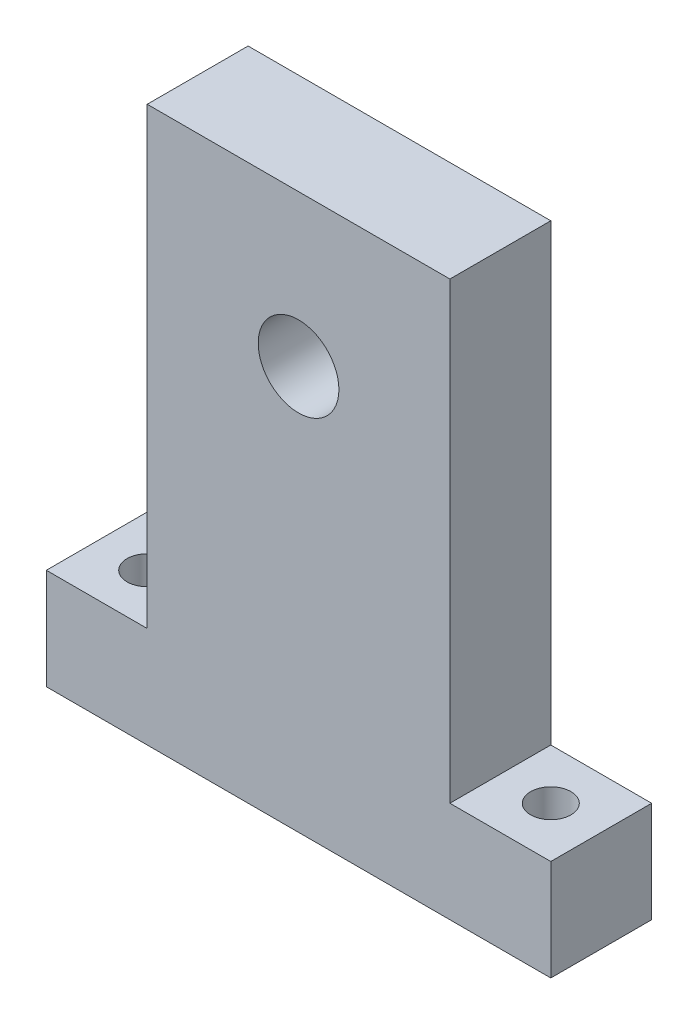
ISO-10303-21;
HEADER;
FILE_DESCRIPTION(('STEP AP214'),'2;1');
FILE_NAME('part.step','',(''),(''),'','','');
FILE_SCHEMA(('AUTOMOTIVE_DESIGN { 1 0 10303 214 1 1 1 1 }'));
ENDSEC;
DATA;
#1=APPLICATION_CONTEXT('core data for automotive mechanical design processes');
#2=APPLICATION_PROTOCOL_DEFINITION('international standard','automotive_design',2000,#1);
#3=PRODUCT_CONTEXT('',#1,'mechanical');
#4=PRODUCT('Part','Part','',(#3));
#5=PRODUCT_RELATED_PRODUCT_CATEGORY('part','',(#4));
#6=PRODUCT_DEFINITION_FORMATION('','',#4);
#7=PRODUCT_DEFINITION_CONTEXT('part definition',#1,'design');
#8=PRODUCT_DEFINITION('design','',#6,#7);
#9=PRODUCT_DEFINITION_SHAPE('','',#8);
#10=(LENGTH_UNIT() NAMED_UNIT(*) SI_UNIT(.MILLI.,.METRE.));
#11=(NAMED_UNIT(*) PLANE_ANGLE_UNIT() SI_UNIT($,.RADIAN.));
#12=(NAMED_UNIT(*) SI_UNIT($,.STERADIAN.) SOLID_ANGLE_UNIT());
#13=UNCERTAINTY_MEASURE_WITH_UNIT(LENGTH_MEASURE(1.E-05),#10,'distance_accuracy_value','');
#14=(GEOMETRIC_REPRESENTATION_CONTEXT(3) GLOBAL_UNCERTAINTY_ASSIGNED_CONTEXT((#13)) GLOBAL_UNIT_ASSIGNED_CONTEXT((#10,
#11,#12)) REPRESENTATION_CONTEXT('',''));
#15=CARTESIAN_POINT('',(0.,0.,0.));
#16=DIRECTION('',(0.,0.,1.));
#17=DIRECTION('',(1.,0.,0.));
#18=AXIS2_PLACEMENT_3D('',#15,#16,#17);
#19=CARTESIAN_POINT('',(0.,10.,0.));
#20=DIRECTION('',(0.,1.,0.));
#21=DIRECTION('',(0.,0.,1.));
#22=AXIS2_PLACEMENT_3D('',#19,#20,#21);
#23=PLANE('',#22);
#24=DIRECTION('',(0.,0.,-1.));
#25=VECTOR('',#24,1.);
#26=CARTESIAN_POINT('',(15.,10.,5.));
#27=LINE('',#26,#25);
#28=CARTESIAN_POINT('',(15.,10.,5.));
#29=VERTEX_POINT('',#28);
#30=CARTESIAN_POINT('',(15.,10.,-5.));
#31=VERTEX_POINT('',#30);
#32=EDGE_CURVE('E127',#29,#31,#27,.T.);
#33=ORIENTED_EDGE('',*,*,#32,.F.);
#34=DIRECTION('',(1.,0.,0.));
#35=VECTOR('',#34,1.);
#36=CARTESIAN_POINT('',(0.,10.,5.));
#37=LINE('',#36,#35);
#38=CARTESIAN_POINT('',(25.,10.,5.));
#39=VERTEX_POINT('',#38);
#40=EDGE_CURVE('E209',#29,#39,#37,.T.);
#41=ORIENTED_EDGE('',*,*,#40,.T.);
#42=DIRECTION('',(0.,0.,-1.));
#43=VECTOR('',#42,1.);
#44=CARTESIAN_POINT('',(25.,10.,0.));
#45=LINE('',#44,#43);
#46=CARTESIAN_POINT('',(25.,10.,-5.));
#47=VERTEX_POINT('',#46);
#48=EDGE_CURVE('E217',#39,#47,#45,.T.);
#49=ORIENTED_EDGE('',*,*,#48,.T.);
#50=DIRECTION('',(1.,0.,0.));
#51=VECTOR('',#50,1.);
#52=CARTESIAN_POINT('',(0.,10.,-5.));
#53=LINE('',#52,#51);
#54=EDGE_CURVE('E54',#31,#47,#53,.T.);
#55=ORIENTED_EDGE('',*,*,#54,.F.);
#56=EDGE_LOOP('',(#33,#41,#49,#55));
#57=FACE_BOUND('',#56,.T.);
#58=CARTESIAN_POINT('',(20.,10.,0.));
#59=DIRECTION('',(0.,1.,0.));
#60=DIRECTION('',(0.,0.,1.));
#61=AXIS2_PLACEMENT_3D('',#58,#59,#60);
#62=CIRCLE('',#61,2.);
#63=CARTESIAN_POINT('',(20.,10.,2.));
#64=VERTEX_POINT('',#63);
#65=EDGE_CURVE('E149',#64,#64,#62,.T.);
#66=ORIENTED_EDGE('',*,*,#65,.F.);
#67=EDGE_LOOP('',(#66));
#68=FACE_BOUND('',#67,.T.);
#69=ADVANCED_FACE('F37',(#57,#68),#23,.T.);
#70=CARTESIAN_POINT('',(0.,10.,5.));
#71=DIRECTION('',(0.,0.,-1.));
#72=DIRECTION('',(-1.,0.,0.));
#73=AXIS2_PLACEMENT_3D('',#70,#71,#72);
#74=PLANE('',#73);
#75=CARTESIAN_POINT('',(0.,40.,5.));
#76=DIRECTION('',(0.,0.,1.));
#77=DIRECTION('',(1.,0.,0.));
#78=AXIS2_PLACEMENT_3D('',#75,#76,#77);
#79=CIRCLE('',#78,4.);
#80=CARTESIAN_POINT('',(4.,40.,5.));
#81=VERTEX_POINT('',#80);
#82=EDGE_CURVE('E163',#81,#81,#79,.T.);
#83=ORIENTED_EDGE('',*,*,#82,.F.);
#84=EDGE_LOOP('',(#83));
#85=FACE_BOUND('',#84,.T.);
#86=DIRECTION('',(1.,0.,0.));
#87=VECTOR('',#86,1.);
#88=CARTESIAN_POINT('',(0.,0.,5.));
#89=LINE('',#88,#87);
#90=CARTESIAN_POINT('',(-25.,0.,5.));
#91=VERTEX_POINT('',#90);
#92=CARTESIAN_POINT('',(25.,0.,5.));
#93=VERTEX_POINT('',#92);
#94=EDGE_CURVE('E235',#91,#93,#89,.T.);
#95=ORIENTED_EDGE('',*,*,#94,.T.);
#96=DIRECTION('',(0.,-1.,0.));
#97=VECTOR('',#96,1.);
#98=CARTESIAN_POINT('',(25.,10.,5.));
#99=LINE('',#98,#97);
#100=EDGE_CURVE('E11',#39,#93,#99,.T.);
#101=ORIENTED_EDGE('',*,*,#100,.F.);
#102=ORIENTED_EDGE('',*,*,#40,.F.);
#103=DIRECTION('',(0.,-1.,0.));
#104=VECTOR('',#103,1.);
#105=CARTESIAN_POINT('',(15.,55.,5.));
#106=LINE('',#105,#104);
#107=CARTESIAN_POINT('',(15.,55.,5.));
#108=VERTEX_POINT('',#107);
#109=EDGE_CURVE('E142',#108,#29,#106,.T.);
#110=ORIENTED_EDGE('',*,*,#109,.F.);
#111=DIRECTION('',(1.,0.,0.));
#112=VECTOR('',#111,1.);
#113=CARTESIAN_POINT('',(-15.,55.,5.));
#114=LINE('',#113,#112);
#115=CARTESIAN_POINT('',(-15.,55.,5.));
#116=VERTEX_POINT('',#115);
#117=EDGE_CURVE('E121',#116,#108,#114,.T.);
#118=ORIENTED_EDGE('',*,*,#117,.F.);
#119=DIRECTION('',(0.,-1.,0.));
#120=VECTOR('',#119,1.);
#121=CARTESIAN_POINT('',(-15.,55.,5.));
#122=LINE('',#121,#120);
#123=CARTESIAN_POINT('',(-15.,10.,5.));
#124=VERTEX_POINT('',#123);
#125=EDGE_CURVE('E133',#116,#124,#122,.T.);
#126=ORIENTED_EDGE('',*,*,#125,.T.);
#127=CARTESIAN_POINT('',(-25.,10.,5.));
#128=VERTEX_POINT('',#127);
#129=EDGE_CURVE('E210',#128,#124,#37,.T.);
#130=ORIENTED_EDGE('',*,*,#129,.F.);
#131=DIRECTION('',(0.,-1.,0.));
#132=VECTOR('',#131,1.);
#133=CARTESIAN_POINT('',(-25.,10.,5.));
#134=LINE('',#133,#132);
#135=EDGE_CURVE('E224',#128,#91,#134,.T.);
#136=ORIENTED_EDGE('',*,*,#135,.T.);
#137=EDGE_LOOP('',(#95,#101,#102,#110,#118,#126,#130,#136));
#138=FACE_BOUND('',#137,.T.);
#139=ADVANCED_FACE('F181',(#85,#138),#74,.F.);
#140=CARTESIAN_POINT('',(25.,10.,0.));
#141=DIRECTION('',(-1.,0.,0.));
#142=DIRECTION('',(0.,0.,1.));
#143=AXIS2_PLACEMENT_3D('',#140,#141,#142);
#144=PLANE('',#143);
#145=DIRECTION('',(0.,0.,-1.));
#146=VECTOR('',#145,1.);
#147=CARTESIAN_POINT('',(25.,0.,0.));
#148=LINE('',#147,#146);
#149=CARTESIAN_POINT('',(25.,0.,-5.));
#150=VERTEX_POINT('',#149);
#151=EDGE_CURVE('E232',#93,#150,#148,.T.);
#152=ORIENTED_EDGE('',*,*,#151,.T.);
#153=DIRECTION('',(0.,-1.,0.));
#154=VECTOR('',#153,1.);
#155=CARTESIAN_POINT('',(25.,10.,-5.));
#156=LINE('',#155,#154);
#157=EDGE_CURVE('E46',#47,#150,#156,.T.);
#158=ORIENTED_EDGE('',*,*,#157,.F.);
#159=ORIENTED_EDGE('',*,*,#48,.F.);
#160=ORIENTED_EDGE('',*,*,#100,.T.);
#161=EDGE_LOOP('',(#152,#158,#159,#160));
#162=FACE_BOUND('',#161,.T.);
#163=ADVANCED_FACE('F174',(#162),#144,.F.);
#164=CARTESIAN_POINT('',(0.,10.,-5.));
#165=DIRECTION('',(0.,0.,-1.));
#166=DIRECTION('',(-1.,0.,0.));
#167=AXIS2_PLACEMENT_3D('',#164,#165,#166);
#168=PLANE('',#167);
#169=CARTESIAN_POINT('',(0.,40.,-5.));
#170=DIRECTION('',(0.,0.,-1.));
#171=DIRECTION('',(-1.,0.,0.));
#172=AXIS2_PLACEMENT_3D('',#169,#170,#171);
#173=CIRCLE('',#172,4.);
#174=CARTESIAN_POINT('',(4.,40.,-5.));
#175=VERTEX_POINT('',#174);
#176=EDGE_CURVE('E41',#175,#175,#173,.T.);
#177=ORIENTED_EDGE('',*,*,#176,.F.);
#178=EDGE_LOOP('',(#177));
#179=FACE_BOUND('',#178,.T.);
#180=DIRECTION('',(1.,0.,0.));
#181=VECTOR('',#180,1.);
#182=CARTESIAN_POINT('',(0.,0.,-5.));
#183=LINE('',#182,#181);
#184=CARTESIAN_POINT('',(-25.,0.,-5.));
#185=VERTEX_POINT('',#184);
#186=EDGE_CURVE('E229',#185,#150,#183,.T.);
#187=ORIENTED_EDGE('',*,*,#186,.F.);
#188=DIRECTION('',(0.,-1.,0.));
#189=VECTOR('',#188,1.);
#190=CARTESIAN_POINT('',(-25.,10.,-5.));
#191=LINE('',#190,#189);
#192=CARTESIAN_POINT('',(-25.,10.,-5.));
#193=VERTEX_POINT('',#192);
#194=EDGE_CURVE('E222',#193,#185,#191,.T.);
#195=ORIENTED_EDGE('',*,*,#194,.F.);
#196=CARTESIAN_POINT('',(-15.,10.,-5.));
#197=VERTEX_POINT('',#196);
#198=EDGE_CURVE('E241',#193,#197,#53,.T.);
#199=ORIENTED_EDGE('',*,*,#198,.T.);
#200=DIRECTION('',(0.,-1.,0.));
#201=VECTOR('',#200,1.);
#202=CARTESIAN_POINT('',(-15.,55.,-5.));
#203=LINE('',#202,#201);
#204=CARTESIAN_POINT('',(-15.,55.,-5.));
#205=VERTEX_POINT('',#204);
#206=EDGE_CURVE('E112',#205,#197,#203,.T.);
#207=ORIENTED_EDGE('',*,*,#206,.F.);
#208=DIRECTION('',(-1.,0.,0.));
#209=VECTOR('',#208,1.);
#210=CARTESIAN_POINT('',(-15.,55.,-5.));
#211=LINE('',#210,#209);
#212=CARTESIAN_POINT('',(15.,55.,-5.));
#213=VERTEX_POINT('',#212);
#214=EDGE_CURVE('E104',#213,#205,#211,.T.);
#215=ORIENTED_EDGE('',*,*,#214,.F.);
#216=DIRECTION('',(0.,-1.,0.));
#217=VECTOR('',#216,1.);
#218=CARTESIAN_POINT('',(15.,55.,-5.));
#219=LINE('',#218,#217);
#220=EDGE_CURVE('E109',#213,#31,#219,.T.);
#221=ORIENTED_EDGE('',*,*,#220,.T.);
#222=ORIENTED_EDGE('',*,*,#54,.T.);
#223=ORIENTED_EDGE('',*,*,#157,.T.);
#224=EDGE_LOOP('',(#187,#195,#199,#207,#215,#221,#222,#223));
#225=FACE_BOUND('',#224,.T.);
#226=ADVANCED_FACE('F107',(#179,#225),#168,.T.);
#227=CARTESIAN_POINT('',(-20.,10.,0.));
#228=DIRECTION('',(0.,-1.,0.));
#229=DIRECTION('',(0.,0.,-1.));
#230=AXIS2_PLACEMENT_3D('',#227,#228,#229);
#231=CYLINDRICAL_SURFACE('',#230,2.);
#232=CARTESIAN_POINT('',(-20.,10.,0.));
#233=DIRECTION('',(0.,1.,0.));
#234=DIRECTION('',(0.,0.,1.));
#235=AXIS2_PLACEMENT_3D('',#232,#233,#234);
#236=CIRCLE('',#235,2.);
#237=CARTESIAN_POINT('',(-20.,10.,2.));
#238=VERTEX_POINT('',#237);
#239=EDGE_CURVE('E208',#238,#238,#236,.T.);
#240=ORIENTED_EDGE('',*,*,#239,.T.);
#241=EDGE_LOOP('',(#240));
#242=FACE_BOUND('',#241,.T.);
#243=CARTESIAN_POINT('',(-20.,0.,0.));
#244=DIRECTION('',(0.,1.,0.));
#245=DIRECTION('',(0.,0.,1.));
#246=AXIS2_PLACEMENT_3D('',#243,#244,#245);
#247=CIRCLE('',#246,2.);
#248=CARTESIAN_POINT('',(-20.,0.,2.));
#249=VERTEX_POINT('',#248);
#250=EDGE_CURVE('E131',#249,#249,#247,.T.);
#251=ORIENTED_EDGE('',*,*,#250,.F.);
#252=EDGE_LOOP('',(#251));
#253=FACE_BOUND('',#252,.T.);
#254=ADVANCED_FACE('F173',(#242,#253),#231,.F.);
#255=CARTESIAN_POINT('',(20.,10.,0.));
#256=DIRECTION('',(0.,-1.,0.));
#257=DIRECTION('',(0.,0.,-1.));
#258=AXIS2_PLACEMENT_3D('',#255,#256,#257);
#259=CYLINDRICAL_SURFACE('',#258,2.);
#260=ORIENTED_EDGE('',*,*,#65,.T.);
#261=EDGE_LOOP('',(#260));
#262=FACE_BOUND('',#261,.T.);
#263=CARTESIAN_POINT('',(20.,0.,0.));
#264=DIRECTION('',(0.,1.,0.));
#265=DIRECTION('',(0.,0.,1.));
#266=AXIS2_PLACEMENT_3D('',#263,#264,#265);
#267=CIRCLE('',#266,2.);
#268=CARTESIAN_POINT('',(20.,0.,2.));
#269=VERTEX_POINT('',#268);
#270=EDGE_CURVE('E128',#269,#269,#267,.T.);
#271=ORIENTED_EDGE('',*,*,#270,.F.);
#272=EDGE_LOOP('',(#271));
#273=FACE_BOUND('',#272,.T.);
#274=ADVANCED_FACE('F39',(#262,#273),#259,.F.);
#275=CARTESIAN_POINT('',(-25.,10.,0.));
#276=DIRECTION('',(-1.,0.,0.));
#277=DIRECTION('',(0.,0.,1.));
#278=AXIS2_PLACEMENT_3D('',#275,#276,#277);
#279=PLANE('',#278);
#280=DIRECTION('',(0.,0.,-1.));
#281=VECTOR('',#280,1.);
#282=CARTESIAN_POINT('',(-25.,0.,0.));
#283=LINE('',#282,#281);
#284=EDGE_CURVE('E213',#91,#185,#283,.T.);
#285=ORIENTED_EDGE('',*,*,#284,.F.);
#286=ORIENTED_EDGE('',*,*,#135,.F.);
#287=DIRECTION('',(0.,0.,-1.));
#288=VECTOR('',#287,1.);
#289=CARTESIAN_POINT('',(-25.,10.,0.));
#290=LINE('',#289,#288);
#291=EDGE_CURVE('E226',#128,#193,#290,.T.);
#292=ORIENTED_EDGE('',*,*,#291,.T.);
#293=ORIENTED_EDGE('',*,*,#194,.T.);
#294=EDGE_LOOP('',(#285,#286,#292,#293));
#295=FACE_BOUND('',#294,.T.);
#296=ADVANCED_FACE('F198',(#295),#279,.T.);
#297=DIRECTION('',(0.,0.,1.));
#298=VECTOR('',#297,1.);
#299=CARTESIAN_POINT('',(-15.,10.,5.));
#300=LINE('',#299,#298);
#301=EDGE_CURVE('E62',#197,#124,#300,.T.);
#302=ORIENTED_EDGE('',*,*,#301,.F.);
#303=ORIENTED_EDGE('',*,*,#198,.F.);
#304=ORIENTED_EDGE('',*,*,#291,.F.);
#305=ORIENTED_EDGE('',*,*,#129,.T.);
#306=EDGE_LOOP('',(#302,#303,#304,#305));
#307=FACE_BOUND('',#306,.T.);
#308=ORIENTED_EDGE('',*,*,#239,.F.);
#309=EDGE_LOOP('',(#308));
#310=FACE_BOUND('',#309,.T.);
#311=ADVANCED_FACE('F187',(#307,#310),#23,.T.);
#312=CARTESIAN_POINT('',(0.,0.,0.));
#313=DIRECTION('',(0.,1.,0.));
#314=DIRECTION('',(0.,0.,1.));
#315=AXIS2_PLACEMENT_3D('',#312,#313,#314);
#316=PLANE('',#315);
#317=ORIENTED_EDGE('',*,*,#270,.T.);
#318=EDGE_LOOP('',(#317));
#319=FACE_BOUND('',#318,.T.);
#320=ORIENTED_EDGE('',*,*,#250,.T.);
#321=EDGE_LOOP('',(#320));
#322=FACE_BOUND('',#321,.T.);
#323=ORIENTED_EDGE('',*,*,#94,.F.);
#324=ORIENTED_EDGE('',*,*,#284,.T.);
#325=ORIENTED_EDGE('',*,*,#186,.T.);
#326=ORIENTED_EDGE('',*,*,#151,.F.);
#327=EDGE_LOOP('',(#323,#324,#325,#326));
#328=FACE_BOUND('',#327,.T.);
#329=ADVANCED_FACE('F197',(#319,#322,#328),#316,.F.);
#330=CARTESIAN_POINT('',(15.,55.,5.));
#331=DIRECTION('',(-1.,0.,0.));
#332=DIRECTION('',(0.,0.,1.));
#333=AXIS2_PLACEMENT_3D('',#330,#331,#332);
#334=PLANE('',#333);
#335=ORIENTED_EDGE('',*,*,#32,.T.);
#336=ORIENTED_EDGE('',*,*,#220,.F.);
#337=DIRECTION('',(0.,0.,-1.));
#338=VECTOR('',#337,1.);
#339=CARTESIAN_POINT('',(15.,55.,5.));
#340=LINE('',#339,#338);
#341=EDGE_CURVE('E116',#108,#213,#340,.T.);
#342=ORIENTED_EDGE('',*,*,#341,.F.);
#343=ORIENTED_EDGE('',*,*,#109,.T.);
#344=EDGE_LOOP('',(#335,#336,#342,#343));
#345=FACE_BOUND('',#344,.T.);
#346=ADVANCED_FACE('F126',(#345),#334,.F.);
#347=CARTESIAN_POINT('',(-15.,55.,5.));
#348=DIRECTION('',(1.,0.,0.));
#349=DIRECTION('',(0.,0.,-1.));
#350=AXIS2_PLACEMENT_3D('',#347,#348,#349);
#351=PLANE('',#350);
#352=ORIENTED_EDGE('',*,*,#301,.T.);
#353=ORIENTED_EDGE('',*,*,#125,.F.);
#354=DIRECTION('',(0.,0.,1.));
#355=VECTOR('',#354,1.);
#356=CARTESIAN_POINT('',(-15.,55.,5.));
#357=LINE('',#356,#355);
#358=EDGE_CURVE('E115',#205,#116,#357,.T.);
#359=ORIENTED_EDGE('',*,*,#358,.F.);
#360=ORIENTED_EDGE('',*,*,#206,.T.);
#361=EDGE_LOOP('',(#352,#353,#359,#360));
#362=FACE_BOUND('',#361,.T.);
#363=ADVANCED_FACE('F253',(#362),#351,.F.);
#364=CARTESIAN_POINT('',(0.,55.,0.));
#365=DIRECTION('',(0.,-1.,0.));
#366=DIRECTION('',(0.,0.,-1.));
#367=AXIS2_PLACEMENT_3D('',#364,#365,#366);
#368=PLANE('',#367);
#369=ORIENTED_EDGE('',*,*,#341,.T.);
#370=ORIENTED_EDGE('',*,*,#214,.T.);
#371=ORIENTED_EDGE('',*,*,#358,.T.);
#372=ORIENTED_EDGE('',*,*,#117,.T.);
#373=EDGE_LOOP('',(#369,#370,#371,#372));
#374=FACE_BOUND('',#373,.T.);
#375=ADVANCED_FACE('F119',(#374),#368,.F.);
#376=CARTESIAN_POINT('',(0.,40.,-40.));
#377=DIRECTION('',(0.,0.,1.));
#378=DIRECTION('',(1.,0.,0.));
#379=AXIS2_PLACEMENT_3D('',#376,#377,#378);
#380=CYLINDRICAL_SURFACE('',#379,4.);
#381=CARTESIAN_POINT('',(4.,40.,-5.));
#382=CARTESIAN_POINT('',(4.,40.,-4.89583333333334));
#383=CARTESIAN_POINT('',(4.,40.,-4.79166666666667));
#384=CARTESIAN_POINT('',(4.,40.,-4.58333333333334));
#385=CARTESIAN_POINT('',(4.,40.,-4.47916666666667));
#386=CARTESIAN_POINT('',(4.,40.,-4.27083333333334));
#387=CARTESIAN_POINT('',(4.,40.,-4.16666666666667));
#388=CARTESIAN_POINT('',(4.,40.,-3.95833333333334));
#389=CARTESIAN_POINT('',(4.,40.,-3.85416666666667));
#390=CARTESIAN_POINT('',(4.,40.,-3.64583333333334));
#391=CARTESIAN_POINT('',(4.,40.,-3.54166666666667));
#392=CARTESIAN_POINT('',(4.,40.,-3.33333333333334));
#393=CARTESIAN_POINT('',(4.,40.,-3.22916666666667));
#394=CARTESIAN_POINT('',(4.,40.,-3.02083333333334));
#395=CARTESIAN_POINT('',(4.,40.,-2.91666666666667));
#396=CARTESIAN_POINT('',(4.,40.,-2.70833333333334));
#397=CARTESIAN_POINT('',(4.,40.,-2.60416666666667));
#398=CARTESIAN_POINT('',(4.,40.,-2.39583333333334));
#399=CARTESIAN_POINT('',(4.,40.,-2.29166666666667));
#400=CARTESIAN_POINT('',(4.,40.,-2.08333333333334));
#401=CARTESIAN_POINT('',(4.,40.,-1.97916666666667));
#402=CARTESIAN_POINT('',(4.,40.,-1.77083333333334));
#403=CARTESIAN_POINT('',(4.,40.,-1.66666666666667));
#404=CARTESIAN_POINT('',(4.,40.,-1.45833333333333));
#405=CARTESIAN_POINT('',(4.,40.,-1.35416666666667));
#406=CARTESIAN_POINT('',(4.,40.,-1.14583333333333));
#407=CARTESIAN_POINT('',(4.,40.,-1.04166666666667));
#408=CARTESIAN_POINT('',(4.,40.,-0.833333333333334));
#409=CARTESIAN_POINT('',(4.,40.,-0.729166666666667));
#410=CARTESIAN_POINT('',(4.,40.,-0.520833333333334));
#411=CARTESIAN_POINT('',(4.,40.,-0.416666666666667));
#412=CARTESIAN_POINT('',(4.,40.,-0.208333333333334));
#413=CARTESIAN_POINT('',(4.,40.,-0.104166666666667));
#414=CARTESIAN_POINT('',(4.,40.,0.104166666666667));
#415=CARTESIAN_POINT('',(4.,40.,0.208333333333334));
#416=CARTESIAN_POINT('',(4.,40.,0.416666666666667));
#417=CARTESIAN_POINT('',(4.,40.,0.520833333333334));
#418=CARTESIAN_POINT('',(4.,40.,0.729166666666667));
#419=CARTESIAN_POINT('',(4.,40.,0.833333333333334));
#420=CARTESIAN_POINT('',(4.,40.,1.04166666666667));
#421=CARTESIAN_POINT('',(4.,40.,1.14583333333333));
#422=CARTESIAN_POINT('',(4.,40.,1.35416666666667));
#423=CARTESIAN_POINT('',(4.,40.,1.45833333333333));
#424=CARTESIAN_POINT('',(4.,40.,1.66666666666667));
#425=CARTESIAN_POINT('',(4.,40.,1.77083333333334));
#426=CARTESIAN_POINT('',(4.,40.,1.97916666666667));
#427=CARTESIAN_POINT('',(4.,40.,2.08333333333334));
#428=CARTESIAN_POINT('',(4.,40.,2.29166666666667));
#429=CARTESIAN_POINT('',(4.,40.,2.39583333333334));
#430=CARTESIAN_POINT('',(4.,40.,2.60416666666667));
#431=CARTESIAN_POINT('',(4.,40.,2.70833333333334));
#432=CARTESIAN_POINT('',(4.,40.,2.91666666666667));
#433=CARTESIAN_POINT('',(4.,40.,3.02083333333334));
#434=CARTESIAN_POINT('',(4.,40.,3.22916666666667));
#435=CARTESIAN_POINT('',(4.,40.,3.33333333333334));
#436=CARTESIAN_POINT('',(4.,40.,3.54166666666667));
#437=CARTESIAN_POINT('',(4.,40.,3.64583333333334));
#438=CARTESIAN_POINT('',(4.,40.,3.85416666666667));
#439=CARTESIAN_POINT('',(4.,40.,3.95833333333334));
#440=CARTESIAN_POINT('',(4.,40.,4.16666666666667));
#441=CARTESIAN_POINT('',(4.,40.,4.27083333333334));
#442=CARTESIAN_POINT('',(4.,40.,4.47916666666667));
#443=CARTESIAN_POINT('',(4.,40.,4.58333333333334));
#444=CARTESIAN_POINT('',(4.,40.,4.79166666666667));
#445=CARTESIAN_POINT('',(4.,40.,4.89583333333334));
#446=CARTESIAN_POINT('',(4.,40.,5.));
#447=B_SPLINE_CURVE_WITH_KNOTS('',3,(#381,#382,#383,#384,#385,#386,#387,#388,#389,#390,#391,
#392,#393,#394,#395,#396,#397,#398,#399,#400,#401,#402,#403,#404,#405,#406,#407,#408,#409,#410,
#411,#412,#413,#414,#415,#416,#417,#418,#419,#420,#421,#422,#423,#424,#425,#426,#427,#428,#429,
#430,#431,#432,#433,#434,#435,#436,#437,#438,#439,#440,#441,#442,#443,#444,#445,#446),
.UNSPECIFIED.,.F.,.F.,(4,2,2,2,2,2,2,2,2,2,2,2,2,2,2,2,2,2,2,2,2,2,2,2,2,2,2,2,2,2,2,2,4),(0.,
0.3125,0.625000000000001,0.937500000000001,1.25,1.5625,1.875,2.1875,2.5,2.8125,3.125,3.4375,
3.75,4.0625,4.375,4.6875,5.,5.3125,5.62500000000001,5.93750000000001,6.25000000000001,
6.56250000000001,6.87500000000001,7.18750000000001,7.50000000000001,7.81250000000001,
8.12500000000001,8.43750000000001,8.75000000000001,9.06250000000001,9.37500000000001,
9.68750000000001,10.),.UNSPECIFIED.);
#448=EDGE_CURVE('BSEAM170',#175,#81,#447,.T.);
#449=ORIENTED_EDGE('',*,*,#176,.T.);
#450=ORIENTED_EDGE('',*,*,#82,.T.);
#451=ORIENTED_EDGE('',*,*,#448,.T.);
#452=ORIENTED_EDGE('',*,*,#448,.F.);
#453=EDGE_LOOP('',(#449,#451,#450,#452));
#454=FACE_BOUND('',#453,.T.);
#455=ADVANCED_FACE('F170',(#454),#380,.F.);
#456=CLOSED_SHELL('',(#69,#139,#163,#226,#254,#274,#296,#311,#329,#346,#363,#375,#455));
#457=MANIFOLD_SOLID_BREP('B2',#456);
#458=ADVANCED_BREP_SHAPE_REPRESENTATION('',(#18,#457),#14);
#459=SHAPE_DEFINITION_REPRESENTATION(#9,#458);
ENDSEC;
END-ISO-10303-21;
